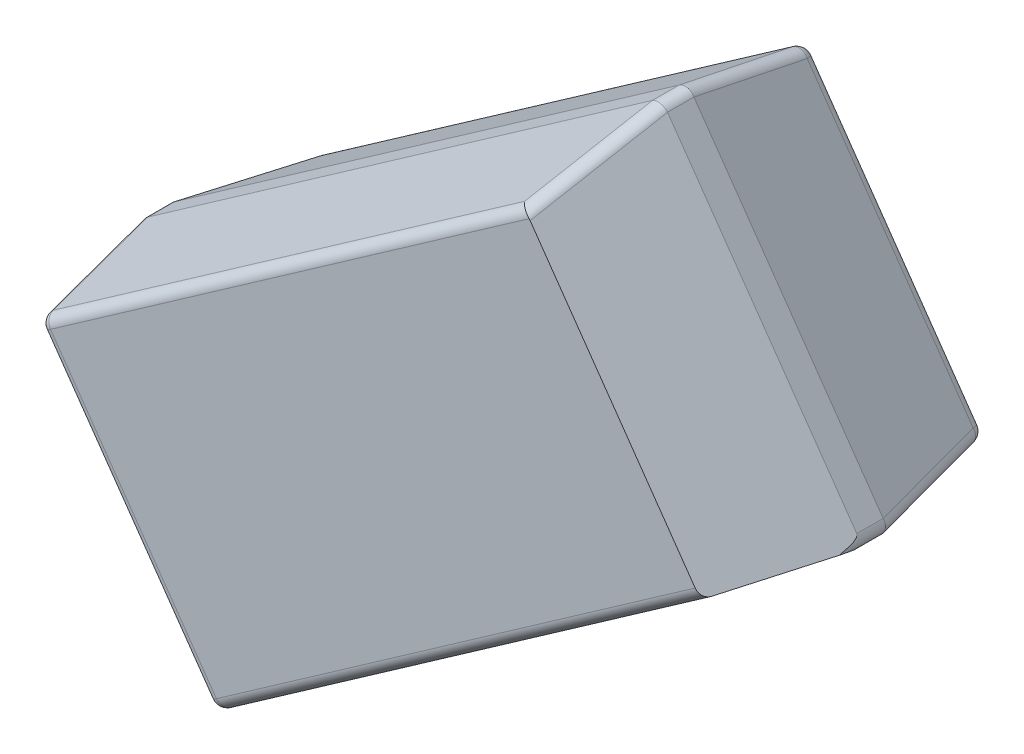
ISO-10303-21;
HEADER;
FILE_DESCRIPTION(('STEP AP214'),'2;1');
FILE_NAME('part.step','',(''),(''),'','','');
FILE_SCHEMA(('AUTOMOTIVE_DESIGN { 1 0 10303 214 1 1 1 1 }'));
ENDSEC;
DATA;
#1=APPLICATION_CONTEXT('core data for automotive mechanical design processes');
#2=APPLICATION_PROTOCOL_DEFINITION('international standard','automotive_design',2000,#1);
#3=PRODUCT_CONTEXT('',#1,'mechanical');
#4=PRODUCT('Part','Part','',(#3));
#5=PRODUCT_RELATED_PRODUCT_CATEGORY('part','',(#4));
#6=PRODUCT_DEFINITION_FORMATION('','',#4);
#7=PRODUCT_DEFINITION_CONTEXT('part definition',#1,'design');
#8=PRODUCT_DEFINITION('design','',#6,#7);
#9=PRODUCT_DEFINITION_SHAPE('','',#8);
#10=(LENGTH_UNIT() NAMED_UNIT(*) SI_UNIT(.MILLI.,.METRE.));
#11=(NAMED_UNIT(*) PLANE_ANGLE_UNIT() SI_UNIT($,.RADIAN.));
#12=(NAMED_UNIT(*) SI_UNIT($,.STERADIAN.) SOLID_ANGLE_UNIT());
#13=UNCERTAINTY_MEASURE_WITH_UNIT(LENGTH_MEASURE(1.E-05),#10,'distance_accuracy_value','');
#14=(GEOMETRIC_REPRESENTATION_CONTEXT(3) GLOBAL_UNCERTAINTY_ASSIGNED_CONTEXT((#13)) GLOBAL_UNIT_ASSIGNED_CONTEXT((#10,
#11,#12)) REPRESENTATION_CONTEXT('',''));
#15=CARTESIAN_POINT('',(0.,0.,0.));
#16=DIRECTION('',(0.,0.,1.));
#17=DIRECTION('',(1.,0.,0.));
#18=AXIS2_PLACEMENT_3D('',#15,#16,#17);
#19=CARTESIAN_POINT('',(-18.50000066,-12.50000066,0.15));
#20=DIRECTION('',(0.,0.,1.));
#21=DIRECTION('',(0.,-1.,0.));
#22=AXIS2_PLACEMENT_3D('',#19,#20,#21);
#23=PLANE('',#22);
#24=DIRECTION('',(-0.819152022341012,-0.573576467696008,0.));
#25=VECTOR('',#24,1.);
#26=CARTESIAN_POINT('',(-18.5804042414506,-11.7531730258792,0.15));
#27=LINE('',#26,#25);
#28=CARTESIAN_POINT('',(-17.8059918704513,-11.2109236018615,0.15));
#29=VERTEX_POINT('',#28);
#30=CARTESIAN_POINT('',(-19.9487018286501,-12.7112653889783,0.15));
#31=VERTEX_POINT('',#30);
#32=EDGE_CURVE('E371',#29,#31,#27,.T.);
#33=ORIENTED_EDGE('',*,*,#32,.F.);
#34=DIRECTION('',(-0.57357646769616,0.819152022340906,0.));
#35=VECTOR('',#34,1.);
#36=CARTESIAN_POINT('',(-17.05129949134,-12.28873593101,0.15));
#37=LINE('',#36,#35);
#38=CARTESIAN_POINT('',(-17.0512994913422,-12.2887359310134,0.15));
#39=VERTEX_POINT('',#38);
#40=EDGE_CURVE('E489',#39,#29,#37,.T.);
#41=ORIENTED_EDGE('',*,*,#40,.F.);
#42=DIRECTION('',(0.819152022341012,0.573576467696008,0.));
#43=VECTOR('',#42,1.);
#44=CARTESIAN_POINT('',(-18.4195970785395,-13.2468282941108,0.15));
#45=LINE('',#44,#43);
#46=CARTESIAN_POINT('',(-19.194009449541,-13.7890777181301,0.15));
#47=VERTEX_POINT('',#46);
#48=EDGE_CURVE('E480',#47,#39,#45,.T.);
#49=ORIENTED_EDGE('',*,*,#48,.F.);
#50=DIRECTION('',(0.57357646769616,-0.819152022340906,0.));
#51=VECTOR('',#50,1.);
#52=CARTESIAN_POINT('',(-19.94870182865,-12.71126538898,0.15));
#53=LINE('',#52,#51);
#54=EDGE_CURVE('E487',#31,#47,#53,.T.);
#55=ORIENTED_EDGE('',*,*,#54,.F.);
#56=EDGE_LOOP('',(#33,#41,#49,#55));
#57=FACE_BOUND('',#56,.T.);
#58=ADVANCED_FACE('F17',(#57),#23,.F.);
#59=CARTESIAN_POINT('',(-19.94870182865,-12.71126538898,0.2));
#60=DIRECTION('',(-0.709941870026649,0.125181878410511,-0.693045480831295));
#61=DIRECTION('',(-0.462052605287746,0.659879453510562,0.592508647009821));
#62=AXIS2_PLACEMENT_3D('',#59,#60,#61);
#63=SPHERICAL_SURFACE('',#62,0.05);
#64=CARTESIAN_POINT('',(-19.9841989221513,-12.7050062950595,0.165347725958436));
#65=VERTEX_POINT('',#64);
#66=VERTEX_LOOP('',#65);
#67=FACE_BOUND('',#66,.T.);
#68=CARTESIAN_POINT('',(-19.9487018286505,-12.7112653889763,0.2));
#69=DIRECTION('',(0.573576467696008,-0.819152022341012,0.));
#70=DIRECTION('',(0.819152022341012,0.573576467696008,0.));
#71=AXIS2_PLACEMENT_3D('',#68,#69,#70);
#72=CIRCLE('',#71,0.05);
#73=CARTESIAN_POINT('',(-19.9890639109881,-12.7395272255888,0.191504654174845));
#74=VERTEX_POINT('',#73);
#75=EDGE_CURVE('E471',#74,#31,#72,.T.);
#76=ORIENTED_EDGE('',*,*,#75,.F.);
#77=CARTESIAN_POINT('',(-19.9487018286545,-12.7112653889744,0.199999999998666));
#78=DIRECTION('',(-0.233290799812884,0.0411354531536796,0.971536554750518));
#79=DIRECTION('',(0.972359580287034,0.,0.23348842931508));
#80=AXIS2_PLACEMENT_3D('',#77,#78,#79);
#81=CIRCLE('',#80,0.05);
#82=CARTESIAN_POINT('',(-19.9769636652648,-12.6709033066402,0.191504654174139));
#83=VERTEX_POINT('',#82);
#84=EDGE_CURVE('E374',#83,#74,#81,.T.);
#85=ORIENTED_EDGE('',*,*,#84,.F.);
#86=CARTESIAN_POINT('',(-19.9487018286498,-12.7112653889802,0.2));
#87=DIRECTION('',(-0.819152022341012,-0.573576467696008,0.));
#88=DIRECTION('',(0.573576467696008,-0.819152022341012,0.));
#89=AXIS2_PLACEMENT_3D('',#86,#87,#88);
#90=CIRCLE('',#89,0.05);
#91=EDGE_CURVE('E375',#31,#83,#90,.F.);
#92=ORIENTED_EDGE('',*,*,#91,.F.);
#93=EDGE_LOOP('',(#76,#85,#92));
#94=FACE_BOUND('',#93,.T.);
#95=ADVANCED_FACE('F387',(#67,#94),#63,.T.);
#96=CARTESIAN_POINT('',(-19.19400944954,-13.78907771813,0.2));
#97=DIRECTION('',(-0.125181878409739,-0.70994187002694,-0.693045480831136));
#98=DIRECTION('',(-0.462052605287539,0.659879453510564,-0.592508647009979));
#99=AXIS2_PLACEMENT_3D('',#96,#97,#98);
#100=SPHERICAL_SURFACE('',#99,0.05);
#101=CARTESIAN_POINT('',(-19.2002685434605,-13.8245748116313,0.165347725958443));
#102=VERTEX_POINT('',#101);
#103=VERTEX_LOOP('',#102);
#104=FACE_BOUND('',#103,.T.);
#105=CARTESIAN_POINT('',(-19.1940094495357,-13.7890777181339,0.199999999999223));
#106=DIRECTION('',(0.0411354531536796,0.233290799812884,-0.971536554750518));
#107=DIRECTION('',(0.,0.972359580287034,0.23348842931508));
#108=AXIS2_PLACEMENT_3D('',#105,#106,#107);
#109=CIRCLE('',#108,0.05);
#110=CARTESIAN_POINT('',(-19.2343715318768,-13.8173395547398,0.191504654175525));
#111=VERTEX_POINT('',#110);
#112=CARTESIAN_POINT('',(-19.1657476129291,-13.8294398004712,0.191504654174199));
#113=VERTEX_POINT('',#112);
#114=EDGE_CURVE('E362',#111,#113,#109,.F.);
#115=ORIENTED_EDGE('',*,*,#114,.F.);
#116=CARTESIAN_POINT('',(-19.1940094495388,-13.7890777181291,0.2));
#117=DIRECTION('',(0.573576467696008,-0.819152022341012,0.));
#118=DIRECTION('',(0.819152022341012,0.573576467696008,0.));
#119=AXIS2_PLACEMENT_3D('',#116,#117,#118);
#120=CIRCLE('',#119,0.05);
#121=EDGE_CURVE('E474',#47,#111,#120,.F.);
#122=ORIENTED_EDGE('',*,*,#121,.F.);
#123=CARTESIAN_POINT('',(-19.1940094495432,-13.7890777181311,0.2));
#124=DIRECTION('',(0.819152022341012,0.573576467696008,0.));
#125=DIRECTION('',(-0.573576467696008,0.819152022341012,0.));
#126=AXIS2_PLACEMENT_3D('',#123,#124,#125);
#127=CIRCLE('',#126,0.05);
#128=EDGE_CURVE('E481',#113,#47,#127,.T.);
#129=ORIENTED_EDGE('',*,*,#128,.F.);
#130=EDGE_LOOP('',(#115,#122,#129));
#131=FACE_BOUND('',#130,.T.);
#132=ADVANCED_FACE('F383',(#104,#131),#100,.T.);
#133=CARTESIAN_POINT('',(-18.41959707854,-13.24682829411,0.2));
#134=DIRECTION('',(0.819152022341012,0.573576467696008,0.));
#135=DIRECTION('',(-0.573576467696008,0.819152022341012,0.));
#136=AXIS2_PLACEMENT_3D('',#133,#134,#135);
#137=CYLINDRICAL_SURFACE('',#136,0.05);
#138=ORIENTED_EDGE('',*,*,#128,.T.);
#139=ORIENTED_EDGE('',*,*,#48,.T.);
#140=CARTESIAN_POINT('',(-17.0512994913402,-12.2887359310098,0.2));
#141=DIRECTION('',(0.819152022341012,0.573576467696008,0.));
#142=DIRECTION('',(-0.573576467696008,0.819152022341012,0.));
#143=AXIS2_PLACEMENT_3D('',#140,#141,#142);
#144=CIRCLE('',#143,0.05);
#145=CARTESIAN_POINT('',(-17.0230376547252,-12.3290980133498,0.19150465417414));
#146=VERTEX_POINT('',#145);
#147=EDGE_CURVE('E20',#39,#146,#144,.F.);
#148=ORIENTED_EDGE('',*,*,#147,.T.);
#149=DIRECTION('',(0.819152022341188,0.573576467695757,0.));
#150=VECTOR('',#149,1.);
#151=CARTESIAN_POINT('',(-18.688277850023,-13.4951118459894,0.1915046541747));
#152=LINE('',#151,#150);
#153=EDGE_CURVE('E356',#113,#146,#152,.T.);
#154=ORIENTED_EDGE('',*,*,#153,.F.);
#155=EDGE_LOOP('',(#138,#139,#148,#154));
#156=FACE_BOUND('',#155,.T.);
#157=ADVANCED_FACE('F386',(#156),#137,.T.);
#158=CARTESIAN_POINT('',(-18.58040424145,-11.75317302588,0.2));
#159=DIRECTION('',(-0.819152022341012,-0.573576467696008,0.));
#160=DIRECTION('',(0.573576467696008,-0.819152022341012,0.));
#161=AXIS2_PLACEMENT_3D('',#158,#159,#160);
#162=CYLINDRICAL_SURFACE('',#161,0.05);
#163=CARTESIAN_POINT('',(-17.8059918704468,-11.2109236018589,0.2));
#164=DIRECTION('',(-0.819152022341012,-0.573576467696008,0.));
#165=DIRECTION('',(0.573576467696008,-0.819152022341012,0.));
#166=AXIS2_PLACEMENT_3D('',#163,#164,#165);
#167=CIRCLE('',#166,0.05);
#168=CARTESIAN_POINT('',(-17.8342537070627,-11.1705615195219,0.191504654174942));
#169=VERTEX_POINT('',#168);
#170=EDGE_CURVE('E465',#29,#169,#167,.F.);
#171=ORIENTED_EDGE('',*,*,#170,.F.);
#172=ORIENTED_EDGE('',*,*,#32,.T.);
#173=ORIENTED_EDGE('',*,*,#91,.T.);
#174=DIRECTION('',(-0.819152022341188,-0.573576467695757,0.));
#175=VECTOR('',#174,1.);
#176=CARTESIAN_POINT('',(-18.311723469967,-11.5048894740006,0.1915046541747));
#177=LINE('',#176,#175);
#178=EDGE_CURVE('E323',#169,#83,#177,.T.);
#179=ORIENTED_EDGE('',*,*,#178,.F.);
#180=EDGE_LOOP('',(#171,#172,#173,#179));
#181=FACE_BOUND('',#180,.T.);
#182=ADVANCED_FACE('F597',(#181),#162,.T.);
#183=CARTESIAN_POINT('',(-19.96193876969,-12.70893135965,0.255125071795));
#184=DIRECTION('',(-0.233290799812884,0.0411354531536796,0.971536554750518));
#185=DIRECTION('',(0.972359580287034,0.,0.23348842931508));
#186=AXIS2_PLACEMENT_3D('',#183,#184,#185);
#187=CYLINDRICAL_SURFACE('',#186,0.05);
#188=DIRECTION('',(0.233290799808274,-0.0411354531465209,-0.971536554751928));
#189=VECTOR('',#188,1.);
#190=CARTESIAN_POINT('',(-20.1183631738192,-12.7167282820694,0.729969782023173));
#191=LINE('',#190,#189);
#192=CARTESIAN_POINT('',(-20.1181583084919,-12.7170254017363,0.729984891011441));
#193=VERTEX_POINT('',#192);
#194=EDGE_CURVE('E310',#193,#74,#191,.T.);
#195=ORIENTED_EDGE('',*,*,#194,.F.);
#196=CARTESIAN_POINT('',(-20.0769958420501,-12.6886436980106,0.734278779400096));
#197=DIRECTION('',(-0.117484398387176,0.0207156646126642,0.99285863917038));
#198=DIRECTION('',(0.977774892097314,-0.172408055958372,0.119296783798814));
#199=AXIS2_PLACEMENT_3D('',#196,#197,#198);
#200=ELLIPSE('',#199,0.0503596363343118,0.05);
#201=CARTESIAN_POINT('',(-20.1059687967684,-12.6478952300052,0.729984891011267));
#202=VERTEX_POINT('',#201);
#203=EDGE_CURVE('E313',#202,#193,#200,.T.);
#204=ORIENTED_EDGE('',*,*,#203,.F.);
#205=DIRECTION('',(-0.233290799819824,0.0411354531486388,0.971536554749065));
#206=VECTOR('',#205,1.);
#207=CARTESIAN_POINT('',(-19.9769636652618,-12.6709033066374,0.191504654174455));
#208=LINE('',#207,#206);
#209=EDGE_CURVE('E320',#83,#202,#208,.T.);
#210=ORIENTED_EDGE('',*,*,#209,.F.);
#211=ORIENTED_EDGE('',*,*,#84,.T.);
#212=EDGE_LOOP('',(#195,#204,#210,#211));
#213=FACE_BOUND('',#212,.T.);
#214=ADVANCED_FACE('F601',(#213),#187,.T.);
#215=CARTESIAN_POINT('',(-19.68607093263,-13.08634114909,0.2));
#216=DIRECTION('',(0.573576467696008,-0.819152022341012,0.));
#217=DIRECTION('',(0.819152022341012,0.573576467696008,0.));
#218=AXIS2_PLACEMENT_3D('',#215,#216,#217);
#219=CYLINDRICAL_SURFACE('',#218,0.05);
#220=ORIENTED_EDGE('',*,*,#75,.T.);
#221=ORIENTED_EDGE('',*,*,#54,.T.);
#222=ORIENTED_EDGE('',*,*,#121,.T.);
#223=DIRECTION('',(0.573576467695757,-0.819152022341188,0.));
#224=VECTOR('',#223,1.);
#225=CARTESIAN_POINT('',(-19.8411483085095,-12.9507725812271,0.19150465417573));
#226=LINE('',#225,#224);
#227=EDGE_CURVE('E307',#74,#111,#226,.T.);
#228=ORIENTED_EDGE('',*,*,#227,.F.);
#229=EDGE_LOOP('',(#220,#221,#222,#228));
#230=FACE_BOUND('',#229,.T.);
#231=ADVANCED_FACE('F591',(#230),#219,.T.);
#232=CARTESIAN_POINT('',(-19.19858287435,-13.81501490494,0.308015083019));
#233=DIRECTION('',(0.0411354531536796,0.233290799812884,-0.971536554750518));
#234=DIRECTION('',(0.,0.972359580287034,0.23348842931508));
#235=AXIS2_PLACEMENT_3D('',#232,#233,#234);
#236=CYLINDRICAL_SURFACE('',#235,0.05);
#237=DIRECTION('',(0.0411354531545856,0.233290799813576,-0.971536554750313));
#238=VECTOR('',#237,1.);
#239=CARTESIAN_POINT('',(-19.1885465564517,-13.9587390633076,0.729969782023515));
#240=LINE('',#239,#238);
#241=CARTESIAN_POINT('',(-19.1882494367828,-13.9585341979782,0.729984891011585));
#242=VERTEX_POINT('',#241);
#243=EDGE_CURVE('E359',#242,#113,#240,.T.);
#244=ORIENTED_EDGE('',*,*,#243,.F.);
#245=CARTESIAN_POINT('',(-19.2166311404995,-13.9173717315301,0.734278779402916));
#246=DIRECTION('',(-0.0207156646126642,-0.117484398387176,0.99285863917038));
#247=DIRECTION('',(0.172408055958372,0.977774892097314,0.119296783798814));
#248=AXIS2_PLACEMENT_3D('',#245,#246,#247);
#249=ELLIPSE('',#248,0.0503596363343118,0.05);
#250=CARTESIAN_POINT('',(-19.2573796085091,-13.9463446862444,0.729984891011699));
#251=VERTEX_POINT('',#250);
#252=EDGE_CURVE('E301',#251,#242,#249,.T.);
#253=ORIENTED_EDGE('',*,*,#252,.F.);
#254=DIRECTION('',(-0.0411354531486389,-0.233290799819824,0.971536554749065));
#255=VECTOR('',#254,1.);
#256=CARTESIAN_POINT('',(-19.234371531877,-13.8173395547379,0.191504654175622));
#257=LINE('',#256,#255);
#258=EDGE_CURVE('E304',#111,#251,#257,.T.);
#259=ORIENTED_EDGE('',*,*,#258,.F.);
#260=ORIENTED_EDGE('',*,*,#114,.T.);
#261=EDGE_LOOP('',(#244,#253,#259,#260));
#262=FACE_BOUND('',#261,.T.);
#263=ADVANCED_FACE('F557',(#262),#236,.T.);
#264=CARTESIAN_POINT('',(-18.66370352542,-13.53020761583,0.44));
#265=DIRECTION('',(0.56523673224367,-0.807241646748528,-0.169906916507901));
#266=DIRECTION('',(0.819152022341188,0.573576467695757,0.));
#267=AXIS2_PLACEMENT_3D('',#264,#265,#266);
#268=PLANE('',#267);
#269=ORIENTED_EDGE('',*,*,#153,.T.);
#270=DIRECTION('',(0.233290799819818,-0.041135453148642,0.971536554749066));
#271=VECTOR('',#270,1.);
#272=CARTESIAN_POINT('',(-17.0230376547282,-12.3290980133526,0.191504654174456));
#273=LINE('',#272,#271);
#274=CARTESIAN_POINT('',(-16.8940325232222,-12.352106089984,0.729984891011267));
#275=VERTEX_POINT('',#274);
#276=EDGE_CURVE('E352',#146,#275,#273,.T.);
#277=ORIENTED_EDGE('',*,*,#276,.T.);
#278=DIRECTION('',(0.819152022341012,0.573576467696008,0.));
#279=VECTOR('',#278,1.);
#280=CARTESIAN_POINT('',(-19.22890991823,-13.98700815603,0.73));
#281=LINE('',#280,#279);
#282=EDGE_CURVE('E296',#242,#275,#281,.T.);
#283=ORIENTED_EDGE('',*,*,#282,.F.);
#284=ORIENTED_EDGE('',*,*,#243,.T.);
#285=EDGE_LOOP('',(#269,#277,#283,#284));
#286=FACE_BOUND('',#285,.T.);
#287=ADVANCED_FACE('F347',(#286),#268,.T.);
#288=CARTESIAN_POINT('',(-17.05129949134,-12.28873593101,0.2));
#289=DIRECTION('',(0.709941870026649,-0.125181878410511,-0.693045480831295));
#290=DIRECTION('',(-0.462052605287746,0.659879453510562,-0.592508647009821));
#291=AXIS2_PLACEMENT_3D('',#288,#289,#290);
#292=SPHERICAL_SURFACE('',#291,0.05);
#293=CARTESIAN_POINT('',(-17.0158023978387,-12.2949950249305,0.165347725958436));
#294=VERTEX_POINT('',#293);
#295=VERTEX_LOOP('',#294);
#296=FACE_BOUND('',#295,.T.);
#297=CARTESIAN_POINT('',(-17.0512994913355,-12.2887359310156,0.199999999998667));
#298=DIRECTION('',(-0.233290799812884,0.0411354531536796,-0.971536554750518));
#299=DIRECTION('',(-0.972359580287034,0.,0.23348842931508));
#300=AXIS2_PLACEMENT_3D('',#297,#298,#299);
#301=CIRCLE('',#300,0.05);
#302=CARTESIAN_POINT('',(-17.0109374090035,-12.2604740944023,0.191504654175171));
#303=VERTEX_POINT('',#302);
#304=EDGE_CURVE('E290',#146,#303,#301,.F.);
#305=ORIENTED_EDGE('',*,*,#304,.F.);
#306=ORIENTED_EDGE('',*,*,#147,.F.);
#307=CARTESIAN_POINT('',(-17.0512994913442,-12.288735931017,0.2));
#308=DIRECTION('',(-0.573576467696008,0.819152022341012,0.));
#309=DIRECTION('',(-0.819152022341012,-0.573576467696008,0.));
#310=AXIS2_PLACEMENT_3D('',#307,#308,#309);
#311=CIRCLE('',#310,0.05);
#312=EDGE_CURVE('E355',#303,#39,#311,.T.);
#313=ORIENTED_EDGE('',*,*,#312,.F.);
#314=EDGE_LOOP('',(#305,#306,#313));
#315=FACE_BOUND('',#314,.T.);
#316=ADVANCED_FACE('F343',(#296,#315),#292,.T.);
#317=CARTESIAN_POINT('',(-17.31393038736,-11.91366017091,0.2));
#318=DIRECTION('',(-0.573576467696008,0.819152022341012,0.));
#319=DIRECTION('',(-0.819152022341012,-0.573576467696008,0.));
#320=AXIS2_PLACEMENT_3D('',#317,#318,#319);
#321=CYLINDRICAL_SURFACE('',#320,0.05);
#322=ORIENTED_EDGE('',*,*,#312,.T.);
#323=ORIENTED_EDGE('',*,*,#40,.T.);
#324=CARTESIAN_POINT('',(-17.8059918704559,-11.2109236018641,0.2));
#325=DIRECTION('',(-0.573576467696008,0.819152022341012,0.));
#326=DIRECTION('',(-0.819152022341012,-0.573576467696008,0.));
#327=AXIS2_PLACEMENT_3D('',#324,#325,#326);
#328=CIRCLE('',#327,0.05);
#329=CARTESIAN_POINT('',(-17.7656297881154,-11.1826617652522,0.191504654176035));
#330=VERTEX_POINT('',#329);
#331=EDGE_CURVE('E328',#330,#29,#328,.T.);
#332=ORIENTED_EDGE('',*,*,#331,.F.);
#333=DIRECTION('',(-0.573576467695757,0.819152022341188,0.));
#334=VECTOR('',#333,1.);
#335=CARTESIAN_POINT('',(-17.1588530114805,-12.0492287387629,0.191504654175729));
#336=LINE('',#335,#334);
#337=EDGE_CURVE('E276',#303,#330,#336,.T.);
#338=ORIENTED_EDGE('',*,*,#337,.F.);
#339=EDGE_LOOP('',(#322,#323,#332,#338));
#340=FACE_BOUND('',#339,.T.);
#341=ADVANCED_FACE('F338',(#340),#321,.T.);
#342=CARTESIAN_POINT('',(-17.80599187045,-11.21092360186,0.2));
#343=DIRECTION('',(0.125181878409739,0.70994187002694,-0.693045480831136));
#344=DIRECTION('',(-0.462052605287539,0.659879453510564,0.592508647009979));
#345=AXIS2_PLACEMENT_3D('',#342,#343,#344);
#346=SPHERICAL_SURFACE('',#345,0.05);
#347=CARTESIAN_POINT('',(-17.7997327765295,-11.1754265083587,0.165347725958443));
#348=VERTEX_POINT('',#347);
#349=VERTEX_LOOP('',#348);
#350=FACE_BOUND('',#349,.T.);
#351=CARTESIAN_POINT('',(-17.8059918704543,-11.2109236018561,0.199999999999223));
#352=DIRECTION('',(-0.0411354531536796,-0.233290799812884,-0.971536554750518));
#353=DIRECTION('',(0.,0.972359580287034,-0.23348842931508));
#354=AXIS2_PLACEMENT_3D('',#351,#352,#353);
#355=CIRCLE('',#354,0.05);
#356=EDGE_CURVE('E270',#330,#169,#355,.F.);
#357=ORIENTED_EDGE('',*,*,#356,.F.);
#358=ORIENTED_EDGE('',*,*,#331,.T.);
#359=ORIENTED_EDGE('',*,*,#170,.T.);
#360=EDGE_LOOP('',(#357,#358,#359));
#361=FACE_BOUND('',#360,.T.);
#362=ADVANCED_FACE('F333',(#350,#361),#346,.T.);
#363=CARTESIAN_POINT('',(-18.33629779457,-11.46979370416,0.44));
#364=DIRECTION('',(-0.56523673224367,0.807241646748528,-0.169906916507901));
#365=DIRECTION('',(-0.819152022341188,-0.573576467695757,0.));
#366=AXIS2_PLACEMENT_3D('',#363,#364,#365);
#367=PLANE('',#366);
#368=ORIENTED_EDGE('',*,*,#209,.T.);
#369=DIRECTION('',(-0.819152022341012,-0.573576467696008,0.));
#370=VECTOR('',#369,1.);
#371=CARTESIAN_POINT('',(-17.77109140176,-11.01299316396,0.73));
#372=LINE('',#371,#370);
#373=CARTESIAN_POINT('',(-17.8117518832079,-11.0414671220159,0.72998489101104));
#374=VERTEX_POINT('',#373);
#375=EDGE_CURVE('E264',#374,#202,#372,.T.);
#376=ORIENTED_EDGE('',*,*,#375,.F.);
#377=DIRECTION('',(-0.0411354531536796,-0.233290799812884,-0.971536554750518));
#378=VECTOR('',#377,1.);
#379=CARTESIAN_POINT('',(-17.8296802822486,-11.1446243327102,0.299519737192883));
#380=LINE('',#379,#378);
#381=EDGE_CURVE('E267',#169,#374,#380,.F.);
#382=ORIENTED_EDGE('',*,*,#381,.F.);
#383=ORIENTED_EDGE('',*,*,#178,.T.);
#384=EDGE_LOOP('',(#368,#376,#382,#383));
#385=FACE_BOUND('',#384,.T.);
#386=ADVANCED_FACE('F337',(#385),#367,.T.);
#387=CARTESIAN_POINT('',(-20.07699584205,-12.68864369801,0.15));
#388=DIRECTION('',(0.,0.,1.));
#389=DIRECTION('',(0.,-1.,0.));
#390=AXIS2_PLACEMENT_3D('',#387,#388,#389);
#391=CYLINDRICAL_SURFACE('',#390,0.05);
#392=DIRECTION('',(0.,0.,1.));
#393=VECTOR('',#392,1.);
#394=CARTESIAN_POINT('',(-20.1056746654336,-12.6476860968948,0.15));
#395=LINE('',#394,#393);
#396=CARTESIAN_POINT('',(-20.1059501216608,-12.6478817607239,0.850013699255884));
#397=VERTEX_POINT('',#396);
#398=EDGE_CURVE('E261',#202,#397,#395,.T.);
#399=ORIENTED_EDGE('',*,*,#398,.F.);
#400=ORIENTED_EDGE('',*,*,#203,.T.);
#401=DIRECTION('',(0.,0.,1.));
#402=VECTOR('',#401,1.);
#403=CARTESIAN_POINT('',(-20.1179534431621,-12.7173225214015,0.15));
#404=LINE('',#403,#402);
#405=CARTESIAN_POINT('',(-20.1181453663985,-12.717044445979,0.850013699255644));
#406=VERTEX_POINT('',#405);
#407=EDGE_CURVE('E249',#406,#193,#404,.F.);
#408=ORIENTED_EDGE('',*,*,#407,.F.);
#409=CARTESIAN_POINT('',(-20.0769958420505,-12.6886436980128,0.845861873456313));
#410=DIRECTION('',(0.113726052951248,-0.0200529670578071,0.993309751986916));
#411=DIRECTION('',(0.978219151499467,-0.172486390860182,-0.11548045985227));
#412=AXIS2_PLACEMENT_3D('',#409,#410,#411);
#413=ELLIPSE('',#412,0.0503367654450035,0.05);
#414=EDGE_CURVE('E258',#397,#406,#413,.T.);
#415=ORIENTED_EDGE('',*,*,#414,.F.);
#416=EDGE_LOOP('',(#399,#400,#408,#415));
#417=FACE_BOUND('',#416,.T.);
#418=ADVANCED_FACE('F637',(#417),#391,.T.);
#419=CARTESIAN_POINT('',(-19.87624407835,-12.97534690583,0.44));
#420=DIRECTION('',(-0.807241646748528,-0.56523673224367,-0.169906916507901));
#421=DIRECTION('',(0.573576467695757,-0.819152022341188,0.));
#422=AXIS2_PLACEMENT_3D('',#419,#420,#421);
#423=PLANE('',#422);
#424=ORIENTED_EDGE('',*,*,#227,.T.);
#425=ORIENTED_EDGE('',*,*,#258,.T.);
#426=DIRECTION('',(0.573576467696008,-0.819152022341012,0.));
#427=VECTOR('',#426,1.);
#428=CARTESIAN_POINT('',(-20.14663226655,-12.67636492028,0.73));
#429=LINE('',#428,#427);
#430=EDGE_CURVE('E252',#193,#251,#429,.T.);
#431=ORIENTED_EDGE('',*,*,#430,.F.);
#432=ORIENTED_EDGE('',*,*,#194,.T.);
#433=EDGE_LOOP('',(#424,#425,#431,#432));
#434=FACE_BOUND('',#433,.T.);
#435=ADVANCED_FACE('F589',(#434),#423,.T.);
#436=CARTESIAN_POINT('',(-19.2166311405,-13.91737173153,0.15));
#437=DIRECTION('',(0.,0.,1.));
#438=DIRECTION('',(0.,-1.,0.));
#439=AXIS2_PLACEMENT_3D('',#436,#437,#438);
#440=CYLINDRICAL_SURFACE('',#439,0.05);
#441=DIRECTION('',(0.,0.,1.));
#442=VECTOR('',#441,1.);
#443=CARTESIAN_POINT('',(-19.2575887416201,-13.9460505549101,0.15));
#444=LINE('',#443,#442);
#445=CARTESIAN_POINT('',(-19.2573930777897,-13.9463260111398,0.85001369925585));
#446=VERTEX_POINT('',#445);
#447=EDGE_CURVE('E253',#251,#446,#444,.T.);
#448=ORIENTED_EDGE('',*,*,#447,.F.);
#449=ORIENTED_EDGE('',*,*,#252,.T.);
#450=DIRECTION('',(0.,0.,1.));
#451=VECTOR('',#450,1.);
#452=CARTESIAN_POINT('',(-19.1879523171152,-13.9583293326468,0.15));
#453=LINE('',#452,#451);
#454=CARTESIAN_POINT('',(-19.1882303925377,-13.9585212558833,0.850013699256229));
#455=VERTEX_POINT('',#454);
#456=EDGE_CURVE('E293',#455,#242,#453,.F.);
#457=ORIENTED_EDGE('',*,*,#456,.F.);
#458=CARTESIAN_POINT('',(-19.2166311404998,-13.91737173153,0.845861873482462));
#459=DIRECTION('',(0.0200529670578071,0.113726052951248,0.993309751986916));
#460=DIRECTION('',(0.172486390860182,0.978219151499467,-0.11548045985227));
#461=AXIS2_PLACEMENT_3D('',#458,#459,#460);
#462=ELLIPSE('',#461,0.0503367654450035,0.05);
#463=EDGE_CURVE('E248',#446,#455,#462,.T.);
#464=ORIENTED_EDGE('',*,*,#463,.F.);
#465=EDGE_LOOP('',(#448,#449,#457,#464));
#466=FACE_BOUND('',#465,.T.);
#467=ADVANCED_FACE('F563',(#466),#440,.T.);
#468=CARTESIAN_POINT('',(-19.22890991823,-13.98700815603,0.15));
#469=DIRECTION('',(0.573576467696008,-0.819152022341012,0.));
#470=DIRECTION('',(0.819152022341012,0.573576467696008,0.));
#471=AXIS2_PLACEMENT_3D('',#468,#469,#470);
#472=PLANE('',#471);
#473=ORIENTED_EDGE('',*,*,#456,.T.);
#474=ORIENTED_EDGE('',*,*,#282,.T.);
#475=DIRECTION('',(0.,0.,1.));
#476=VECTOR('',#475,1.);
#477=CARTESIAN_POINT('',(-16.8943266545564,-12.3523152230952,0.15));
#478=LINE('',#477,#476);
#479=CARTESIAN_POINT('',(-16.8943266545608,-12.3523152230961,0.849999999989951));
#480=VERTEX_POINT('',#479);
#481=EDGE_CURVE('E297',#275,#480,#478,.T.);
#482=ORIENTED_EDGE('',*,*,#481,.T.);
#483=DIRECTION('',(0.819152022341229,0.573576467695698,0.));
#484=VECTOR('',#483,1.);
#485=CARTESIAN_POINT('',(-18.6350247020353,-13.5711652169469,0.850000000000618));
#486=LINE('',#485,#484);
#487=EDGE_CURVE('E235',#455,#480,#486,.T.);
#488=ORIENTED_EDGE('',*,*,#487,.F.);
#489=EDGE_LOOP('',(#473,#474,#482,#488));
#490=FACE_BOUND('',#489,.T.);
#491=ADVANCED_FACE('F566',(#490),#472,.T.);
#492=CARTESIAN_POINT('',(-17.0380625503,-12.29106996034,0.255125071795));
#493=DIRECTION('',(-0.233290799812884,0.0411354531536796,-0.971536554750518));
#494=DIRECTION('',(-0.972359580287034,0.,0.23348842931508));
#495=AXIS2_PLACEMENT_3D('',#492,#493,#494);
#496=CYLINDRICAL_SURFACE('',#495,0.05);
#497=DIRECTION('',(-0.23329079980828,0.0411354531465271,-0.971536554751926));
#498=VECTOR('',#497,1.);
#499=CARTESIAN_POINT('',(-16.8816381461708,-12.2832730379206,0.729969782023172));
#500=LINE('',#499,#498);
#501=CARTESIAN_POINT('',(-16.8818430114992,-12.2829759182545,0.729984891011441));
#502=VERTEX_POINT('',#501);
#503=EDGE_CURVE('E287',#502,#303,#500,.T.);
#504=ORIENTED_EDGE('',*,*,#503,.F.);
#505=CARTESIAN_POINT('',(-16.9230054779498,-12.3113576219786,0.734278779359726));
#506=DIRECTION('',(0.117484398387176,-0.0207156646126642,0.99285863917038));
#507=DIRECTION('',(-0.977774892097314,0.172408055958372,0.119296783798814));
#508=AXIS2_PLACEMENT_3D('',#505,#506,#507);
#509=ELLIPSE('',#508,0.0503596363343118,0.05);
#510=EDGE_CURVE('E232',#275,#502,#509,.T.);
#511=ORIENTED_EDGE('',*,*,#510,.F.);
#512=ORIENTED_EDGE('',*,*,#276,.F.);
#513=ORIENTED_EDGE('',*,*,#304,.T.);
#514=EDGE_LOOP('',(#504,#511,#512,#513));
#515=FACE_BOUND('',#514,.T.);
#516=ADVANCED_FACE('F662',(#515),#496,.T.);
#517=CARTESIAN_POINT('',(-17.12375724164,-12.02465441416,0.44));
#518=DIRECTION('',(0.807241646748528,0.56523673224367,-0.169906916507901));
#519=DIRECTION('',(-0.573576467695757,0.819152022341188,0.));
#520=AXIS2_PLACEMENT_3D('',#517,#518,#519);
#521=PLANE('',#520);
#522=DIRECTION('',(-0.0411354531536796,-0.233290799812884,-0.971536554750518));
#523=VECTOR('',#522,1.);
#524=CARTESIAN_POINT('',(-17.7610563633001,-11.1567245784411,0.299519737194302));
#525=LINE('',#524,#523);
#526=CARTESIAN_POINT('',(-17.7426217114826,-11.0536566337468,0.729984891011651));
#527=VERTEX_POINT('',#526);
#528=EDGE_CURVE('E273',#527,#330,#525,.T.);
#529=ORIENTED_EDGE('',*,*,#528,.F.);
#530=DIRECTION('',(-0.573576467696008,0.819152022341012,0.));
#531=VECTOR('',#530,1.);
#532=CARTESIAN_POINT('',(-16.85336905344,-12.32363639971,0.73));
#533=LINE('',#532,#531);
#534=EDGE_CURVE('E226',#502,#527,#533,.T.);
#535=ORIENTED_EDGE('',*,*,#534,.F.);
#536=ORIENTED_EDGE('',*,*,#503,.T.);
#537=ORIENTED_EDGE('',*,*,#337,.T.);
#538=EDGE_LOOP('',(#529,#535,#536,#537));
#539=FACE_BOUND('',#538,.T.);
#540=ADVANCED_FACE('F669',(#539),#521,.T.);
#541=CARTESIAN_POINT('',(-17.80141844564,-11.18498641505,0.308015083019));
#542=DIRECTION('',(-0.0411354531536796,-0.233290799812884,-0.971536554750518));
#543=DIRECTION('',(0.,0.972359580287034,-0.23348842931508));
#544=AXIS2_PLACEMENT_3D('',#541,#542,#543);
#545=CYLINDRICAL_SURFACE('',#544,0.05);
#546=ORIENTED_EDGE('',*,*,#381,.T.);
#547=CARTESIAN_POINT('',(-17.7833701794913,-11.0826295884698,0.734278779362525));
#548=DIRECTION('',(0.0207156646126642,0.117484398387176,0.99285863917038));
#549=DIRECTION('',(-0.172408055958372,-0.977774892097314,0.119296783798814));
#550=AXIS2_PLACEMENT_3D('',#547,#548,#549);
#551=ELLIPSE('',#550,0.0503596363343118,0.05);
#552=EDGE_CURVE('E215',#527,#374,#551,.T.);
#553=ORIENTED_EDGE('',*,*,#552,.F.);
#554=ORIENTED_EDGE('',*,*,#528,.T.);
#555=ORIENTED_EDGE('',*,*,#356,.T.);
#556=EDGE_LOOP('',(#546,#553,#554,#555));
#557=FACE_BOUND('',#556,.T.);
#558=ADVANCED_FACE('F677',(#557),#545,.T.);
#559=CARTESIAN_POINT('',(-17.77109140176,-11.01299316396,0.15));
#560=DIRECTION('',(-0.573576467696008,0.819152022341012,0.));
#561=DIRECTION('',(-0.819152022341012,-0.573576467696008,0.));
#562=AXIS2_PLACEMENT_3D('',#559,#560,#561);
#563=PLANE('',#562);
#564=ORIENTED_EDGE('',*,*,#398,.T.);
#565=DIRECTION('',(-0.819152022341229,-0.573576467695698,0.));
#566=VECTOR('',#565,1.);
#567=CARTESIAN_POINT('',(-18.3649766179547,-11.4288361030431,0.850000000000619));
#568=LINE('',#567,#566);
#569=CARTESIAN_POINT('',(-17.8117709274493,-11.041480064111,0.85001369925591));
#570=VERTEX_POINT('',#569);
#571=EDGE_CURVE('E210',#570,#397,#568,.T.);
#572=ORIENTED_EDGE('',*,*,#571,.F.);
#573=DIRECTION('',(0.,0.,1.));
#574=VECTOR('',#573,1.);
#575=CARTESIAN_POINT('',(-17.8120490028702,-11.0416719873497,0.15));
#576=LINE('',#575,#574);
#577=EDGE_CURVE('E221',#374,#570,#576,.T.);
#578=ORIENTED_EDGE('',*,*,#577,.F.);
#579=ORIENTED_EDGE('',*,*,#375,.T.);
#580=EDGE_LOOP('',(#564,#572,#578,#579));
#581=FACE_BOUND('',#580,.T.);
#582=ADVANCED_FACE('F685',(#581),#563,.T.);
#583=CARTESIAN_POINT('',(-19.96475919708,-12.70843404232,1.329387467026));
#584=DIRECTION('',(0.225930394902911,-0.0398376154695843,0.973328526784617));
#585=DIRECTION('',(0.974101800830843,0.,-0.226109888368708));
#586=AXIS2_PLACEMENT_3D('',#583,#584,#585);
#587=CYLINDRICAL_SURFACE('',#586,0.05);
#588=DIRECTION('',(0.22593039489961,-0.0398376154717751,0.973328526785293));
#589=VECTOR('',#588,1.);
#590=CARTESIAN_POINT('',(-20.1062255778885,-12.6480774245522,0.850027398511561));
#591=LINE('',#590,#589);
#592=CARTESIAN_POINT('',(-19.9766571331397,-12.6709238321005,1.40821994936447));
#593=VERTEX_POINT('',#592);
#594=EDGE_CURVE('E206',#397,#593,#591,.T.);
#595=ORIENTED_EDGE('',*,*,#594,.F.);
#596=ORIENTED_EDGE('',*,*,#414,.T.);
#597=DIRECTION('',(-0.225930394898375,0.0398376154629853,-0.97332852678594));
#598=VECTOR('',#597,1.);
#599=CARTESIAN_POINT('',(-19.9887688448873,-12.7396127780981,1.40821994936444));
#600=LINE('',#599,#598);
#601=CARTESIAN_POINT('',(-19.9887688448867,-12.7396127781014,1.40821994936884));
#602=VERTEX_POINT('',#601);
#603=EDGE_CURVE('E578',#602,#406,#600,.T.);
#604=ORIENTED_EDGE('',*,*,#603,.F.);
#605=CARTESIAN_POINT('',(-19.9483685160093,-12.7113241609783,1.39999999999847));
#606=DIRECTION('',(0.225930394902911,-0.0398376154695843,0.973328526784617));
#607=DIRECTION('',(0.974101800830843,0.,-0.226109888368708));
#608=AXIS2_PLACEMENT_3D('',#605,#606,#607);
#609=CIRCLE('',#608,0.05);
#610=EDGE_CURVE('E209',#593,#602,#609,.T.);
#611=ORIENTED_EDGE('',*,*,#610,.F.);
#612=EDGE_LOOP('',(#595,#596,#604,#611));
#613=FACE_BOUND('',#612,.T.);
#614=ADVANCED_FACE('F693',(#613),#587,.T.);
#615=CARTESIAN_POINT('',(-20.14663226655,-12.67636492028,0.15));
#616=DIRECTION('',(-0.819152022341012,-0.573576467696008,0.));
#617=DIRECTION('',(0.573576467696008,-0.819152022341012,0.));
#618=AXIS2_PLACEMENT_3D('',#615,#616,#617);
#619=PLANE('',#618);
#620=ORIENTED_EDGE('',*,*,#407,.T.);
#621=ORIENTED_EDGE('',*,*,#430,.T.);
#622=ORIENTED_EDGE('',*,*,#447,.T.);
#623=DIRECTION('',(0.573576467695698,-0.819152022341229,0.));
#624=VECTOR('',#623,1.);
#625=CARTESIAN_POINT('',(-19.917201679467,-13.0040257292148,0.849999999999626));
#626=LINE('',#625,#624);
#627=EDGE_CURVE('E426',#406,#446,#626,.T.);
#628=ORIENTED_EDGE('',*,*,#627,.F.);
#629=EDGE_LOOP('',(#620,#621,#622,#628));
#630=FACE_BOUND('',#629,.T.);
#631=ADVANCED_FACE('F586',(#630),#619,.T.);
#632=CARTESIAN_POINT('',(-19.19894111344,-13.81704658023,1.278071677552));
#633=DIRECTION('',(0.0398376154695843,0.225930394902911,0.973328526784617));
#634=DIRECTION('',(0.,-0.974101800830843,0.226109888368708));
#635=AXIS2_PLACEMENT_3D('',#632,#633,#634);
#636=CYLINDRICAL_SURFACE('',#635,0.05);
#637=DIRECTION('',(0.0398376154657531,0.225930394907734,0.973328526783654));
#638=VECTOR('',#637,1.);
#639=CARTESIAN_POINT('',(-19.2571974139588,-13.9466014673691,0.850027398511748));
#640=LINE('',#639,#638);
#641=CARTESIAN_POINT('',(-19.2343510064154,-13.8170330226168,1.40821994936409));
#642=VERTEX_POINT('',#641);
#643=EDGE_CURVE('E432',#446,#642,#640,.T.);
#644=ORIENTED_EDGE('',*,*,#643,.F.);
#645=ORIENTED_EDGE('',*,*,#463,.T.);
#646=DIRECTION('',(-0.0398376154748121,-0.225930394906189,-0.973328526783642));
#647=VECTOR('',#646,1.);
#648=CARTESIAN_POINT('',(-19.1656620604117,-13.8291447343676,1.40821994936451));
#649=LINE('',#648,#647);
#650=CARTESIAN_POINT('',(-19.1656620604117,-13.8291447343693,1.40821994936959));
#651=VERTEX_POINT('',#650);
#652=EDGE_CURVE('E239',#651,#455,#649,.T.);
#653=ORIENTED_EDGE('',*,*,#652,.F.);
#654=CARTESIAN_POINT('',(-19.193950677538,-13.7887444054941,1.39999999999985));
#655=DIRECTION('',(0.0398376154695843,0.225930394902911,0.973328526784617));
#656=DIRECTION('',(0.,-0.974101800830843,0.226109888368708));
#657=AXIS2_PLACEMENT_3D('',#654,#655,#656);
#658=CIRCLE('',#657,0.05);
#659=EDGE_CURVE('E424',#642,#651,#658,.T.);
#660=ORIENTED_EDGE('',*,*,#659,.F.);
#661=EDGE_LOOP('',(#644,#645,#653,#660));
#662=FACE_BOUND('',#661,.T.);
#663=ADVANCED_FACE('F572',(#662),#636,.T.);
#664=CARTESIAN_POINT('',(-18.66370352542,-13.53020761583,1.15));
#665=DIRECTION('',(0.56577234258817,-0.808006577532243,0.164398987305049));
#666=DIRECTION('',(0.819152022341229,0.573576467695698,0.));
#667=AXIS2_PLACEMENT_3D('',#664,#665,#666);
#668=PLANE('',#667);
#669=ORIENTED_EDGE('',*,*,#652,.T.);
#670=ORIENTED_EDGE('',*,*,#487,.T.);
#671=CARTESIAN_POINT('',(-16.92300547795,-12.31135762198,1.15000000000107));
#672=DIRECTION('',(0.56577234258817,-0.808006577532243,0.164398987305049));
#673=DIRECTION('',(-0.0942953904311802,0.134667762921781,0.986393923832195));
#674=AXIS2_PLACEMENT_3D('',#671,#672,#673);
#675=ELLIPSE('',#674,0.304138126515481,0.05);
#676=CARTESIAN_POINT('',(-16.8737650899667,-12.3200400289763,0.937867965656941));
#677=VERTEX_POINT('',#676);
#678=EDGE_CURVE('E238',#677,#480,#675,.F.);
#679=ORIENTED_EDGE('',*,*,#678,.F.);
#680=DIRECTION('',(-0.225930394906697,0.0398376154665259,0.973328526783863));
#681=VECTOR('',#680,1.);
#682=CARTESIAN_POINT('',(-16.8737650899626,-12.3200400289763,0.937867965643243));
#683=LINE('',#682,#681);
#684=CARTESIAN_POINT('',(-16.9829438579781,-12.3007888707622,1.40821994936483));
#685=VERTEX_POINT('',#684);
#686=EDGE_CURVE('E244',#677,#685,#683,.T.);
#687=ORIENTED_EDGE('',*,*,#686,.T.);
#688=DIRECTION('',(-0.819152022341012,-0.573576467696008,0.));
#689=VECTOR('',#688,1.);
#690=CARTESIAN_POINT('',(-18.3914457317305,-13.2870325806668,1.40821994936415));
#691=LINE('',#690,#689);
#692=EDGE_CURVE('E174',#651,#685,#691,.F.);
#693=ORIENTED_EDGE('',*,*,#692,.F.);
#694=EDGE_LOOP('',(#669,#670,#679,#687,#693));
#695=FACE_BOUND('',#694,.T.);
#696=ADVANCED_FACE('F569',(#695),#668,.T.);
#697=CARTESIAN_POINT('',(-16.92300547795,-12.31135762198,0.15));
#698=DIRECTION('',(0.,0.,1.));
#699=DIRECTION('',(0.,-1.,0.));
#700=AXIS2_PLACEMENT_3D('',#697,#698,#699);
#701=CYLINDRICAL_SURFACE('',#700,0.05);
#702=DIRECTION('',(0.,0.,1.));
#703=VECTOR('',#702,1.);
#704=CARTESIAN_POINT('',(-16.8820478768279,-12.2826787985885,0.15));
#705=LINE('',#704,#703);
#706=CARTESIAN_POINT('',(-16.8820478768304,-12.2826787985919,0.849999999994665));
#707=VERTEX_POINT('',#706);
#708=EDGE_CURVE('E229',#707,#502,#705,.F.);
#709=ORIENTED_EDGE('',*,*,#708,.F.);
#710=CARTESIAN_POINT('',(-16.92300547795,-12.31135762198,1.15000000001913));
#711=DIRECTION('',(0.808006577532243,0.56577234258817,0.164398987305049));
#712=DIRECTION('',(-0.134667762921781,-0.0942953904311802,0.986393923832195));
#713=AXIS2_PLACEMENT_3D('',#710,#711,#712);
#714=ELLIPSE('',#713,0.304138126515481,0.05);
#715=EDGE_CURVE('E171',#677,#707,#714,.T.);
#716=ORIENTED_EDGE('',*,*,#715,.F.);
#717=ORIENTED_EDGE('',*,*,#678,.T.);
#718=ORIENTED_EDGE('',*,*,#481,.F.);
#719=ORIENTED_EDGE('',*,*,#510,.T.);
#720=EDGE_LOOP('',(#709,#716,#717,#718,#719));
#721=FACE_BOUND('',#720,.T.);
#722=ADVANCED_FACE('F720',(#721),#701,.T.);
#723=CARTESIAN_POINT('',(-16.85336905344,-12.32363639971,0.15));
#724=DIRECTION('',(0.819152022341012,0.573576467696008,0.));
#725=DIRECTION('',(-0.573576467696008,0.819152022341012,0.));
#726=AXIS2_PLACEMENT_3D('',#723,#724,#725);
#727=PLANE('',#726);
#728=DIRECTION('',(0.,0.,1.));
#729=VECTOR('',#728,1.);
#730=CARTESIAN_POINT('',(-17.7424125783744,-11.0539507650831,0.15));
#731=LINE('',#730,#729);
#732=CARTESIAN_POINT('',(-17.7426082422033,-11.0536753088523,0.850013699255642));
#733=VERTEX_POINT('',#732);
#734=EDGE_CURVE('E218',#733,#527,#731,.F.);
#735=ORIENTED_EDGE('',*,*,#734,.F.);
#736=DIRECTION('',(-0.573576467695698,0.819152022341229,0.));
#737=VECTOR('',#736,1.);
#738=CARTESIAN_POINT('',(-17.082799640523,-11.9959755907752,0.849999999999626));
#739=LINE('',#738,#737);
#740=EDGE_CURVE('E142',#707,#733,#739,.T.);
#741=ORIENTED_EDGE('',*,*,#740,.F.);
#742=ORIENTED_EDGE('',*,*,#708,.T.);
#743=ORIENTED_EDGE('',*,*,#534,.T.);
#744=EDGE_LOOP('',(#735,#741,#742,#743));
#745=FACE_BOUND('',#744,.T.);
#746=ADVANCED_FACE('F727',(#745),#727,.T.);
#747=CARTESIAN_POINT('',(-17.78337017949,-11.08262958847,0.15));
#748=DIRECTION('',(0.,0.,1.));
#749=DIRECTION('',(0.,-1.,0.));
#750=AXIS2_PLACEMENT_3D('',#747,#748,#749);
#751=CYLINDRICAL_SURFACE('',#750,0.05);
#752=ORIENTED_EDGE('',*,*,#734,.T.);
#753=ORIENTED_EDGE('',*,*,#552,.T.);
#754=ORIENTED_EDGE('',*,*,#577,.T.);
#755=CARTESIAN_POINT('',(-17.7833701794902,-11.08262958847,0.845861873482458));
#756=DIRECTION('',(0.0200529670578071,0.113726052951248,-0.993309751986916));
#757=DIRECTION('',(0.172486390860182,0.978219151499467,0.11548045985227));
#758=AXIS2_PLACEMENT_3D('',#755,#756,#757);
#759=ELLIPSE('',#758,0.0503367654450035,0.05);
#760=EDGE_CURVE('E146',#733,#570,#759,.F.);
#761=ORIENTED_EDGE('',*,*,#760,.F.);
#762=EDGE_LOOP('',(#752,#753,#754,#761));
#763=FACE_BOUND('',#762,.T.);
#764=ADVANCED_FACE('F734',(#763),#751,.T.);
#765=CARTESIAN_POINT('',(-18.33629779457,-11.46979370416,1.15));
#766=DIRECTION('',(-0.56577234258817,0.808006577532243,0.164398987305049));
#767=DIRECTION('',(-0.819152022341229,-0.573576467695698,0.));
#768=AXIS2_PLACEMENT_3D('',#765,#766,#767);
#769=PLANE('',#768);
#770=DIRECTION('',(0.819152022341012,0.573576467696008,0.));
#771=VECTOR('',#770,1.);
#772=CARTESIAN_POINT('',(-18.6085555882595,-11.7129687393232,1.40821994936415));
#773=LINE('',#772,#771);
#774=CARTESIAN_POINT('',(-17.8343392595784,-11.1708565856271,1.40821994936942));
#775=VERTEX_POINT('',#774);
#776=EDGE_CURVE('E500',#775,#593,#773,.F.);
#777=ORIENTED_EDGE('',*,*,#776,.F.);
#778=DIRECTION('',(0.0398376154695843,0.225930394902911,-0.973328526784617));
#779=VECTOR('',#778,1.);
#780=CARTESIAN_POINT('',(-17.8293488236713,-11.1425544108881,1.28629162691883));
#781=LINE('',#780,#779);
#782=EDGE_CURVE('E147',#570,#775,#781,.F.);
#783=ORIENTED_EDGE('',*,*,#782,.F.);
#784=ORIENTED_EDGE('',*,*,#571,.T.);
#785=ORIENTED_EDGE('',*,*,#594,.T.);
#786=EDGE_LOOP('',(#777,#783,#784,#785));
#787=FACE_BOUND('',#786,.T.);
#788=ADVANCED_FACE('F198',(#787),#769,.T.);
#789=CARTESIAN_POINT('',(-19.94836851601,-12.71132416097,1.4));
#790=DIRECTION('',(-0.713071928038162,0.125733791965127,0.689724176031266));
#791=DIRECTION('',(0.46055327286212,-0.657738185069422,0.596046275684675));
#792=AXIS2_PLACEMENT_3D('',#789,#790,#791);
#793=SPHERICAL_SURFACE('',#792,0.05);
#794=CARTESIAN_POINT('',(-19.9840221124119,-12.7050374713717,1.43448620880156));
#795=VERTEX_POINT('',#794);
#796=VERTEX_LOOP('',#795);
#797=FACE_BOUND('',#796,.T.);
#798=ORIENTED_EDGE('',*,*,#610,.T.);
#799=CARTESIAN_POINT('',(-19.9483685160076,-12.7113241609683,1.4));
#800=DIRECTION('',(-0.573576467696008,0.819152022341012,0.));
#801=DIRECTION('',(-0.819152022341012,-0.573576467696008,0.));
#802=AXIS2_PLACEMENT_3D('',#799,#800,#801);
#803=CIRCLE('',#802,0.05);
#804=CARTESIAN_POINT('',(-19.9483685160085,-12.7113241609734,1.45));
#805=VERTEX_POINT('',#804);
#806=EDGE_CURVE('E35',#805,#602,#803,.F.);
#807=ORIENTED_EDGE('',*,*,#806,.F.);
#808=CARTESIAN_POINT('',(-19.9483685160093,-12.7113241609784,1.4));
#809=DIRECTION('',(0.819152022341012,0.573576467696008,0.));
#810=DIRECTION('',(-0.573576467696008,0.819152022341012,0.));
#811=AXIS2_PLACEMENT_3D('',#808,#809,#810);
#812=CIRCLE('',#811,0.05);
#813=EDGE_CURVE('E498',#593,#805,#812,.T.);
#814=ORIENTED_EDGE('',*,*,#813,.F.);
#815=EDGE_LOOP('',(#798,#807,#814));
#816=FACE_BOUND('',#815,.T.);
#817=ADVANCED_FACE('F193',(#797,#816),#793,.T.);
#818=CARTESIAN_POINT('',(-19.87624407835,-12.97534690583,1.15));
#819=DIRECTION('',(-0.808006577532243,-0.56577234258817,0.164398987305049));
#820=DIRECTION('',(0.573576467695698,-0.819152022341229,0.));
#821=AXIS2_PLACEMENT_3D('',#818,#819,#820);
#822=PLANE('',#821);
#823=ORIENTED_EDGE('',*,*,#603,.T.);
#824=ORIENTED_EDGE('',*,*,#627,.T.);
#825=ORIENTED_EDGE('',*,*,#643,.T.);
#826=DIRECTION('',(-0.573576467696008,0.819152022341012,0.));
#827=VECTOR('',#826,1.);
#828=CARTESIAN_POINT('',(-19.7262752191868,-13.1144924958895,1.40821994936403));
#829=LINE('',#828,#827);
#830=EDGE_CURVE('E180',#602,#642,#829,.F.);
#831=ORIENTED_EDGE('',*,*,#830,.F.);
#832=EDGE_LOOP('',(#823,#824,#825,#831));
#833=FACE_BOUND('',#832,.T.);
#834=ADVANCED_FACE('F188',(#833),#822,.T.);
#835=CARTESIAN_POINT('',(-19.19395067754,-13.78874440549,1.4));
#836=DIRECTION('',(-0.125733791964854,-0.713071928038173,0.689724176031304));
#837=DIRECTION('',(0.460553272862052,-0.657738185069534,-0.596046275684605));
#838=AXIS2_PLACEMENT_3D('',#835,#836,#837);
#839=SPHERICAL_SURFACE('',#838,0.05);
#840=CARTESIAN_POINT('',(-19.2002373671382,-13.8243980018919,1.43448620880157));
#841=VERTEX_POINT('',#840);
#842=VERTEX_LOOP('',#841);
#843=FACE_BOUND('',#842,.T.);
#844=ORIENTED_EDGE('',*,*,#659,.T.);
#845=CARTESIAN_POINT('',(-19.1939506775412,-13.7887444054882,1.4));
#846=DIRECTION('',(-0.819152022341012,-0.573576467696008,0.));
#847=DIRECTION('',(0.573576467696008,-0.819152022341012,0.));
#848=AXIS2_PLACEMENT_3D('',#845,#846,#847);
#849=CIRCLE('',#848,0.05);
#850=CARTESIAN_POINT('',(-19.193950677538,-13.7887444054877,1.45));
#851=VERTEX_POINT('',#850);
#852=EDGE_CURVE('E177',#851,#651,#849,.F.);
#853=ORIENTED_EDGE('',*,*,#852,.F.);
#854=CARTESIAN_POINT('',(-19.1939506775359,-13.7887444054853,1.4));
#855=DIRECTION('',(-0.573576467696008,0.819152022341012,0.));
#856=DIRECTION('',(-0.819152022341012,-0.573576467696008,0.));
#857=AXIS2_PLACEMENT_3D('',#854,#855,#856);
#858=CIRCLE('',#857,0.05);
#859=EDGE_CURVE('E163',#642,#851,#858,.T.);
#860=ORIENTED_EDGE('',*,*,#859,.F.);
#861=EDGE_LOOP('',(#844,#853,#860));
#862=FACE_BOUND('',#861,.T.);
#863=ADVANCED_FACE('F183',(#843,#862),#839,.T.);
#864=CARTESIAN_POINT('',(-18.41973434886,-13.24663225179,1.4));
#865=DIRECTION('',(-0.819152022341012,-0.573576467696008,0.));
#866=DIRECTION('',(0.573576467696008,-0.819152022341012,0.));
#867=AXIS2_PLACEMENT_3D('',#864,#865,#866);
#868=CYLINDRICAL_SURFACE('',#867,0.05);
#869=ORIENTED_EDGE('',*,*,#852,.T.);
#870=ORIENTED_EDGE('',*,*,#692,.T.);
#871=CARTESIAN_POINT('',(-17.0101102437502,-12.2596027469645,1.4));
#872=DIRECTION('',(0.808006577532243,0.56577234258817,0.164398987305049));
#873=DIRECTION('',(-0.13466776292046,-0.0942953904330668,0.986393923832195));
#874=AXIS2_PLACEMENT_3D('',#871,#872,#873);
#875=ELLIPSE('',#874,0.0506896877524825,0.05);
#876=CARTESIAN_POINT('',(-17.0169365106015,-12.264382550861,1.45));
#877=VERTEX_POINT('',#876);
#878=EDGE_CURVE('E170',#877,#685,#875,.T.);
#879=ORIENTED_EDGE('',*,*,#878,.F.);
#880=DIRECTION('',(0.81915202234057,0.573576467696639,0.));
#881=VECTOR('',#880,1.);
#882=CARTESIAN_POINT('',(-19.19395067754,-13.78874440549,1.45));
#883=LINE('',#882,#881);
#884=EDGE_CURVE('E161',#851,#877,#883,.T.);
#885=ORIENTED_EDGE('',*,*,#884,.F.);
#886=EDGE_LOOP('',(#869,#870,#879,#885));
#887=FACE_BOUND('',#886,.T.);
#888=ADVANCED_FACE('F187',(#887),#868,.T.);
#889=CARTESIAN_POINT('',(-17.12375724164,-12.02465441416,1.15));
#890=DIRECTION('',(0.808006577532243,0.56577234258817,0.164398987305049));
#891=DIRECTION('',(-0.573576467695698,0.819152022341229,0.));
#892=AXIS2_PLACEMENT_3D('',#889,#890,#891);
#893=PLANE('',#892);
#894=ORIENTED_EDGE('',*,*,#878,.T.);
#895=ORIENTED_EDGE('',*,*,#686,.F.);
#896=ORIENTED_EDGE('',*,*,#715,.T.);
#897=ORIENTED_EDGE('',*,*,#740,.T.);
#898=DIRECTION('',(0.0398376154695843,0.225930394902911,-0.973328526784617));
#899=VECTOR('',#898,1.);
#900=CARTESIAN_POINT('',(-17.7606598776764,-11.1546661226366,1.28629162691807));
#901=LINE('',#900,#899);
#902=CARTESIAN_POINT('',(-17.7673603400932,-11.1926663418456,1.44999999999968));
#903=VERTEX_POINT('',#902);
#904=EDGE_CURVE('E132',#903,#733,#901,.T.);
#905=ORIENTED_EDGE('',*,*,#904,.F.);
#906=DIRECTION('',(-0.573576467694363,0.819152022342164,0.));
#907=VECTOR('',#906,1.);
#908=CARTESIAN_POINT('',(-17.0169365106,-12.26438255086,1.45));
#909=LINE('',#908,#907);
#910=EDGE_CURVE('E137',#877,#903,#909,.T.);
#911=ORIENTED_EDGE('',*,*,#910,.F.);
#912=EDGE_LOOP('',(#894,#895,#896,#897,#905,#911));
#913=FACE_BOUND('',#912,.T.);
#914=ADVANCED_FACE('F135',(#913),#893,.T.);
#915=CARTESIAN_POINT('',(-17.80106020655,-11.18295473977,1.278071677552));
#916=DIRECTION('',(0.0398376154695843,0.225930394902911,-0.973328526784617));
#917=DIRECTION('',(0.,0.974101800830843,0.226109888368708));
#918=AXIS2_PLACEMENT_3D('',#915,#916,#917);
#919=CYLINDRICAL_SURFACE('',#918,0.05);
#920=ORIENTED_EDGE('',*,*,#904,.T.);
#921=ORIENTED_EDGE('',*,*,#760,.T.);
#922=ORIENTED_EDGE('',*,*,#782,.T.);
#923=CARTESIAN_POINT('',(-17.8060506424525,-11.2112569145053,1.39999999999987));
#924=DIRECTION('',(0.563415108952578,0.524400093169491,-0.638410492777009));
#925=DIRECTION('',(0.602050721589064,0.268570126687289,0.751934183080715));
#926=AXIS2_PLACEMENT_3D('',#923,#924,#925);
#927=ELLIPSE('',#926,0.0655904430219459,0.05);
#928=CARTESIAN_POINT('',(-17.771749776171,-11.1872391874108,1.44999999999993));
#929=VERTEX_POINT('',#928);
#930=EDGE_CURVE('E154',#929,#775,#927,.F.);
#931=ORIENTED_EDGE('',*,*,#930,.F.);
#932=CARTESIAN_POINT('',(-17.8080971054074,-11.2228629852562,1.45));
#933=DIRECTION('',(0.,0.,1.));
#934=DIRECTION('',(0.173648139983684,0.984807759656781,0.));
#935=AXIS2_PLACEMENT_3D('',#932,#933,#934);
#936=ELLIPSE('',#935,0.051370116691406,0.05);
#937=EDGE_CURVE('E150',#903,#929,#936,.T.);
#938=ORIENTED_EDGE('',*,*,#937,.F.);
#939=EDGE_LOOP('',(#920,#921,#922,#931,#938));
#940=FACE_BOUND('',#939,.T.);
#941=ADVANCED_FACE('F151',(#940),#919,.T.);
#942=CARTESIAN_POINT('',(-18.58026697113,-11.7533690682,1.4));
#943=DIRECTION('',(0.819152022341012,0.573576467696008,0.));
#944=DIRECTION('',(-0.573576467696008,0.819152022341012,0.));
#945=AXIS2_PLACEMENT_3D('',#942,#943,#944);
#946=CYLINDRICAL_SURFACE('',#945,0.05);
#947=DIRECTION('',(-0.819152022342554,-0.573576467693806,0.));
#948=VECTOR('',#947,1.);
#949=CARTESIAN_POINT('',(-17.77174977617,-11.18723918741,1.45));
#950=LINE('',#949,#948);
#951=EDGE_CURVE('E26',#929,#805,#950,.T.);
#952=ORIENTED_EDGE('',*,*,#951,.F.);
#953=ORIENTED_EDGE('',*,*,#930,.T.);
#954=ORIENTED_EDGE('',*,*,#776,.T.);
#955=ORIENTED_EDGE('',*,*,#813,.T.);
#956=EDGE_LOOP('',(#952,#953,#954,#955));
#957=FACE_BOUND('',#956,.T.);
#958=ADVANCED_FACE('F403',(#957),#946,.T.);
#959=CARTESIAN_POINT('',(-19.68587489031,-13.08620387876,1.4));
#960=DIRECTION('',(-0.573576467696008,0.819152022341012,0.));
#961=DIRECTION('',(-0.819152022341012,-0.573576467696008,0.));
#962=AXIS2_PLACEMENT_3D('',#959,#960,#961);
#963=CYLINDRICAL_SURFACE('',#962,0.05);
#964=ORIENTED_EDGE('',*,*,#859,.T.);
#965=DIRECTION('',(0.573576467694069,-0.81915202234237,0.));
#966=VECTOR('',#965,1.);
#967=CARTESIAN_POINT('',(-19.94836851601,-12.71132416097,1.45));
#968=LINE('',#967,#966);
#969=EDGE_CURVE('E11',#805,#851,#968,.T.);
#970=ORIENTED_EDGE('',*,*,#969,.F.);
#971=ORIENTED_EDGE('',*,*,#806,.T.);
#972=ORIENTED_EDGE('',*,*,#830,.T.);
#973=EDGE_LOOP('',(#964,#970,#971,#972));
#974=FACE_BOUND('',#973,.T.);
#975=ADVANCED_FACE('F398',(#974),#963,.T.);
#976=CARTESIAN_POINT('',(-18.50000066,-12.50000066,1.45));
#977=DIRECTION('',(0.,0.,1.));
#978=DIRECTION('',(0.,-1.,0.));
#979=AXIS2_PLACEMENT_3D('',#976,#977,#978);
#980=PLANE('',#979);
#981=ORIENTED_EDGE('',*,*,#951,.T.);
#982=ORIENTED_EDGE('',*,*,#969,.T.);
#983=ORIENTED_EDGE('',*,*,#884,.T.);
#984=ORIENTED_EDGE('',*,*,#910,.T.);
#985=ORIENTED_EDGE('',*,*,#937,.T.);
#986=EDGE_LOOP('',(#981,#982,#983,#984,#985));
#987=FACE_BOUND('',#986,.T.);
#988=ADVANCED_FACE('F159',(#987),#980,.T.);
#989=CLOSED_SHELL('',(#58,#95,#132,#157,#182,#214,#231,#263,#287,#316,#341,#362,#386,#418,#435,
#467,#491,#516,#540,#558,#582,#614,#631,#663,#696,#722,#746,#764,#788,#817,#834,#863,#888,#914,
#941,#958,#975,#988));
#990=MANIFOLD_SOLID_BREP('B1',#989);
#991=ADVANCED_BREP_SHAPE_REPRESENTATION('',(#18,#990),#14);
#992=SHAPE_DEFINITION_REPRESENTATION(#9,#991);
ENDSEC;
END-ISO-10303-21;
